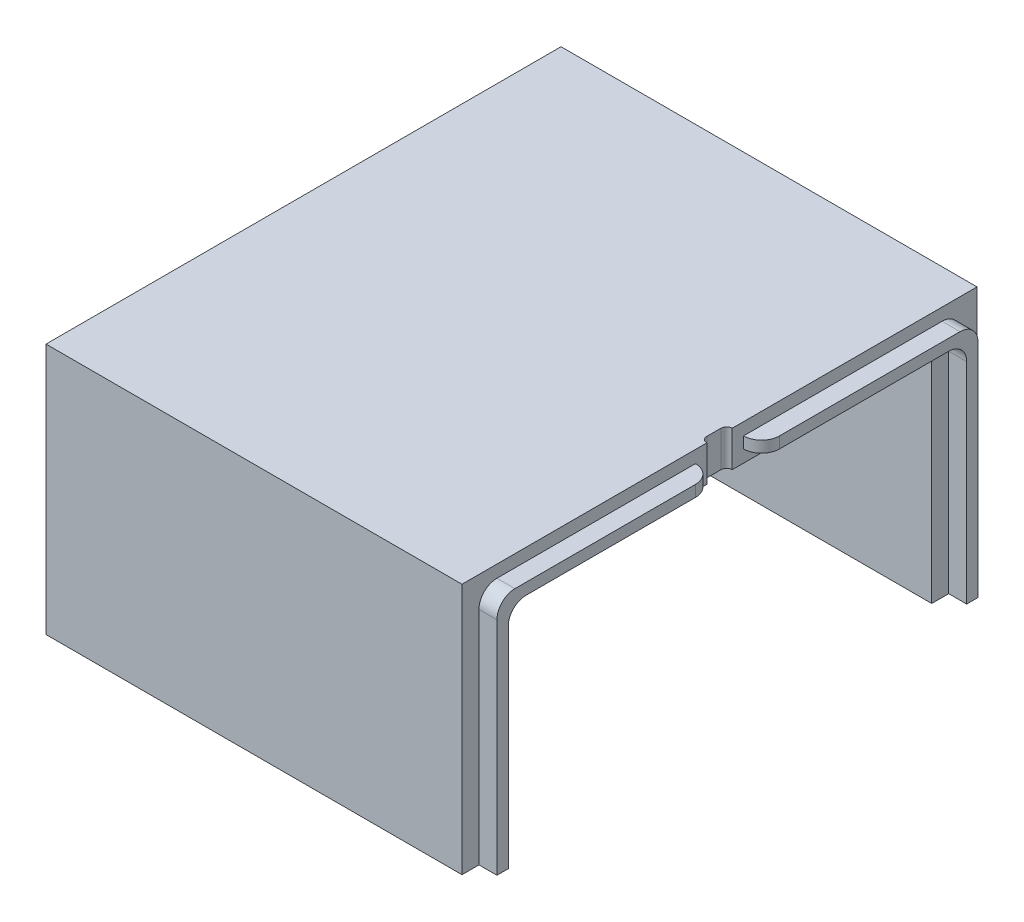
ISO-10303-21;
HEADER;
FILE_DESCRIPTION(('STEP AP214'),'2;1');
FILE_NAME('part.step','',(''),(''),'','','');
FILE_SCHEMA(('AUTOMOTIVE_DESIGN { 1 0 10303 214 1 1 1 1 }'));
ENDSEC;
DATA;
#1=APPLICATION_CONTEXT('core data for automotive mechanical design processes');
#2=APPLICATION_PROTOCOL_DEFINITION('international standard','automotive_design',2000,#1);
#3=PRODUCT_CONTEXT('',#1,'mechanical');
#4=PRODUCT('Part','Part','',(#3));
#5=PRODUCT_RELATED_PRODUCT_CATEGORY('part','',(#4));
#6=PRODUCT_DEFINITION_FORMATION('','',#4);
#7=PRODUCT_DEFINITION_CONTEXT('part definition',#1,'design');
#8=PRODUCT_DEFINITION('design','',#6,#7);
#9=PRODUCT_DEFINITION_SHAPE('','',#8);
#10=(LENGTH_UNIT() NAMED_UNIT(*) SI_UNIT(.MILLI.,.METRE.));
#11=(NAMED_UNIT(*) PLANE_ANGLE_UNIT() SI_UNIT($,.RADIAN.));
#12=(NAMED_UNIT(*) SI_UNIT($,.STERADIAN.) SOLID_ANGLE_UNIT());
#13=UNCERTAINTY_MEASURE_WITH_UNIT(LENGTH_MEASURE(1.E-05),#10,'distance_accuracy_value','');
#14=(GEOMETRIC_REPRESENTATION_CONTEXT(3) GLOBAL_UNCERTAINTY_ASSIGNED_CONTEXT((#13)) GLOBAL_UNIT_ASSIGNED_CONTEXT((#10,
#11,#12)) REPRESENTATION_CONTEXT('',''));
#15=CARTESIAN_POINT('',(0.,0.,0.));
#16=DIRECTION('',(0.,0.,1.));
#17=DIRECTION('',(1.,0.,0.));
#18=AXIS2_PLACEMENT_3D('',#15,#16,#17);
#19=CARTESIAN_POINT('',(0.,19.05,0.));
#20=DIRECTION('',(1.,0.,0.));
#21=DIRECTION('',(0.,0.,-1.));
#22=AXIS2_PLACEMENT_3D('',#19,#20,#21);
#23=PLANE('',#22);
#24=DIRECTION('',(0.,-1.,0.));
#25=VECTOR('',#24,1.);
#26=CARTESIAN_POINT('',(0.,0.,2.5));
#27=LINE('',#26,#25);
#28=CARTESIAN_POINT('',(0.,18.55,2.50000000000001));
#29=VERTEX_POINT('',#28);
#30=CARTESIAN_POINT('',(0.,0.,2.5));
#31=VERTEX_POINT('',#30);
#32=EDGE_CURVE('E249',#29,#31,#27,.T.);
#33=ORIENTED_EDGE('',*,*,#32,.F.);
#34=CARTESIAN_POINT('',(0.,18.55,4.08750000000001));
#35=DIRECTION('',(1.,0.,0.));
#36=DIRECTION('',(0.,0.,-1.));
#37=AXIS2_PLACEMENT_3D('',#34,#35,#36);
#38=CIRCLE('',#37,1.5875);
#39=CARTESIAN_POINT('',(0.,20.1375,4.08750000000001));
#40=VERTEX_POINT('',#39);
#41=EDGE_CURVE('E439',#29,#40,#38,.T.);
#42=ORIENTED_EDGE('',*,*,#41,.T.);
#43=DIRECTION('',(0.,0.,-1.));
#44=VECTOR('',#43,1.);
#45=CARTESIAN_POINT('',(0.,20.1375,0.));
#46=LINE('',#45,#44);
#47=CARTESIAN_POINT('',(0.,20.1375,20.625));
#48=VERTEX_POINT('',#47);
#49=EDGE_CURVE('E270',#48,#40,#46,.T.);
#50=ORIENTED_EDGE('',*,*,#49,.F.);
#51=DIRECTION('',(0.,-1.,0.));
#52=VECTOR('',#51,1.);
#53=CARTESIAN_POINT('',(0.,0.,20.625));
#54=LINE('',#53,#52);
#55=CARTESIAN_POINT('',(0.,21.1375,20.625));
#56=VERTEX_POINT('',#55);
#57=EDGE_CURVE('E267',#56,#48,#54,.T.);
#58=ORIENTED_EDGE('',*,*,#57,.F.);
#59=DIRECTION('',(0.,0.,-1.));
#60=VECTOR('',#59,1.);
#61=CARTESIAN_POINT('',(0.,21.1375,0.));
#62=LINE('',#61,#60);
#63=CARTESIAN_POINT('',(0.,21.1375,3.08750000000001));
#64=VERTEX_POINT('',#63);
#65=EDGE_CURVE('E264',#56,#64,#62,.T.);
#66=ORIENTED_EDGE('',*,*,#65,.T.);
#67=CARTESIAN_POINT('',(0.,19.55,3.08750000000001));
#68=DIRECTION('',(1.,0.,0.));
#69=DIRECTION('',(0.,0.,-1.));
#70=AXIS2_PLACEMENT_3D('',#67,#68,#69);
#71=CIRCLE('',#70,1.5875);
#72=CARTESIAN_POINT('',(0.,19.55,1.50000000000001));
#73=VERTEX_POINT('',#72);
#74=EDGE_CURVE('E11',#64,#73,#71,.F.);
#75=ORIENTED_EDGE('',*,*,#74,.T.);
#76=DIRECTION('',(0.,-1.,0.));
#77=VECTOR('',#76,1.);
#78=CARTESIAN_POINT('',(0.,0.,1.5));
#79=LINE('',#78,#77);
#80=CARTESIAN_POINT('',(0.,0.,1.5));
#81=VERTEX_POINT('',#80);
#82=EDGE_CURVE('E274',#73,#81,#79,.T.);
#83=ORIENTED_EDGE('',*,*,#82,.T.);
#84=DIRECTION('',(0.,0.,1.));
#85=VECTOR('',#84,1.);
#86=CARTESIAN_POINT('',(0.,0.,0.));
#87=LINE('',#86,#85);
#88=CARTESIAN_POINT('',(0.,0.,0.));
#89=VERTEX_POINT('',#88);
#90=EDGE_CURVE('E388',#89,#81,#87,.T.);
#91=ORIENTED_EDGE('',*,*,#90,.F.);
#92=DIRECTION('',(0.,-1.,0.));
#93=VECTOR('',#92,1.);
#94=CARTESIAN_POINT('',(0.,19.05,0.));
#95=LINE('',#94,#93);
#96=CARTESIAN_POINT('',(0.,22.225,0.));
#97=VERTEX_POINT('',#96);
#98=EDGE_CURVE('E408',#97,#89,#95,.T.);
#99=ORIENTED_EDGE('',*,*,#98,.F.);
#100=DIRECTION('',(0.,0.,-1.));
#101=VECTOR('',#100,1.);
#102=CARTESIAN_POINT('',(0.,22.225,0.));
#103=LINE('',#102,#101);
#104=CARTESIAN_POINT('',(0.,22.225,21.625));
#105=VERTEX_POINT('',#104);
#106=EDGE_CURVE('E324',#105,#97,#103,.T.);
#107=ORIENTED_EDGE('',*,*,#106,.F.);
#108=DIRECTION('',(0.,-1.,0.));
#109=VECTOR('',#108,1.);
#110=CARTESIAN_POINT('',(0.,22.225,21.625));
#111=LINE('',#110,#109);
#112=CARTESIAN_POINT('',(0.,19.05,21.625));
#113=VERTEX_POINT('',#112);
#114=EDGE_CURVE('E347',#105,#113,#111,.T.);
#115=ORIENTED_EDGE('',*,*,#114,.T.);
#116=DIRECTION('',(0.,0.,-1.));
#117=VECTOR('',#116,1.);
#118=CARTESIAN_POINT('',(0.,19.05,0.));
#119=LINE('',#118,#117);
#120=CARTESIAN_POINT('',(0.,19.05,4.));
#121=VERTEX_POINT('',#120);
#122=EDGE_CURVE('E323',#113,#121,#119,.T.);
#123=ORIENTED_EDGE('',*,*,#122,.T.);
#124=DIRECTION('',(0.,-1.,0.));
#125=VECTOR('',#124,1.);
#126=CARTESIAN_POINT('',(0.,19.05,4.));
#127=LINE('',#126,#125);
#128=CARTESIAN_POINT('',(0.,0.,4.));
#129=VERTEX_POINT('',#128);
#130=EDGE_CURVE('E410',#121,#129,#127,.T.);
#131=ORIENTED_EDGE('',*,*,#130,.T.);
#132=EDGE_CURVE('E387',#31,#129,#87,.T.);
#133=ORIENTED_EDGE('',*,*,#132,.F.);
#134=EDGE_LOOP('',(#33,#42,#50,#58,#66,#75,#83,#91,#99,#107,#115,#123,#131,#133));
#135=FACE_BOUND('',#134,.T.);
#136=ADVANCED_FACE('F41',(#135),#23,.T.);
#137=CARTESIAN_POINT('',(0.,19.05,41.5));
#138=DIRECTION('',(0.,0.,-1.));
#139=DIRECTION('',(-1.,0.,0.));
#140=AXIS2_PLACEMENT_3D('',#137,#138,#139);
#141=PLANE('',#140);
#142=DIRECTION('',(1.,0.,0.));
#143=VECTOR('',#142,1.);
#144=CARTESIAN_POINT('',(0.,0.,41.5));
#145=LINE('',#144,#143);
#146=CARTESIAN_POINT('',(-32.75,0.,41.5));
#147=VERTEX_POINT('',#146);
#148=CARTESIAN_POINT('',(0.,0.,41.5));
#149=VERTEX_POINT('',#148);
#150=EDGE_CURVE('E368',#147,#149,#145,.T.);
#151=ORIENTED_EDGE('',*,*,#150,.F.);
#152=DIRECTION('',(0.,-1.,0.));
#153=VECTOR('',#152,1.);
#154=CARTESIAN_POINT('',(-32.75,19.05,41.5));
#155=LINE('',#154,#153);
#156=CARTESIAN_POINT('',(-32.75,19.05,41.5));
#157=VERTEX_POINT('',#156);
#158=EDGE_CURVE('E415',#157,#147,#155,.T.);
#159=ORIENTED_EDGE('',*,*,#158,.F.);
#160=DIRECTION('',(1.,0.,0.));
#161=VECTOR('',#160,1.);
#162=CARTESIAN_POINT('',(0.,19.05,41.5));
#163=LINE('',#162,#161);
#164=CARTESIAN_POINT('',(0.,19.05,41.5));
#165=VERTEX_POINT('',#164);
#166=EDGE_CURVE('E369',#157,#165,#163,.T.);
#167=ORIENTED_EDGE('',*,*,#166,.T.);
#168=DIRECTION('',(0.,-1.,0.));
#169=VECTOR('',#168,1.);
#170=CARTESIAN_POINT('',(0.,19.05,41.5));
#171=LINE('',#170,#169);
#172=EDGE_CURVE('E379',#165,#149,#171,.T.);
#173=ORIENTED_EDGE('',*,*,#172,.T.);
#174=EDGE_LOOP('',(#151,#159,#167,#173));
#175=FACE_BOUND('',#174,.T.);
#176=ADVANCED_FACE('F502',(#175),#141,.T.);
#177=CARTESIAN_POINT('',(-32.75,19.05,0.));
#178=DIRECTION('',(1.,0.,0.));
#179=DIRECTION('',(0.,0.,-1.));
#180=AXIS2_PLACEMENT_3D('',#177,#178,#179);
#181=PLANE('',#180);
#182=DIRECTION('',(0.,0.,1.));
#183=VECTOR('',#182,1.);
#184=CARTESIAN_POINT('',(-32.75,0.,0.));
#185=LINE('',#184,#183);
#186=CARTESIAN_POINT('',(-32.75,0.,4.));
#187=VERTEX_POINT('',#186);
#188=EDGE_CURVE('E381',#187,#147,#185,.T.);
#189=ORIENTED_EDGE('',*,*,#188,.F.);
#190=DIRECTION('',(0.,-1.,0.));
#191=VECTOR('',#190,1.);
#192=CARTESIAN_POINT('',(-32.75,19.05,4.));
#193=LINE('',#192,#191);
#194=CARTESIAN_POINT('',(-32.75,19.05,4.));
#195=VERTEX_POINT('',#194);
#196=EDGE_CURVE('E413',#195,#187,#193,.T.);
#197=ORIENTED_EDGE('',*,*,#196,.F.);
#198=DIRECTION('',(0.,0.,1.));
#199=VECTOR('',#198,1.);
#200=CARTESIAN_POINT('',(-32.75,19.05,0.));
#201=LINE('',#200,#199);
#202=EDGE_CURVE('E372',#195,#157,#201,.T.);
#203=ORIENTED_EDGE('',*,*,#202,.T.);
#204=ORIENTED_EDGE('',*,*,#158,.T.);
#205=EDGE_LOOP('',(#189,#197,#203,#204));
#206=FACE_BOUND('',#205,.T.);
#207=ADVANCED_FACE('F508',(#206),#181,.T.);
#208=CARTESIAN_POINT('',(0.,19.05,4.));
#209=DIRECTION('',(0.,0.,1.));
#210=DIRECTION('',(1.,0.,0.));
#211=AXIS2_PLACEMENT_3D('',#208,#209,#210);
#212=PLANE('',#211);
#213=DIRECTION('',(-1.,0.,0.));
#214=VECTOR('',#213,1.);
#215=CARTESIAN_POINT('',(0.,0.,4.));
#216=LINE('',#215,#214);
#217=EDGE_CURVE('E384',#129,#187,#216,.T.);
#218=ORIENTED_EDGE('',*,*,#217,.F.);
#219=ORIENTED_EDGE('',*,*,#130,.F.);
#220=DIRECTION('',(-1.,0.,0.));
#221=VECTOR('',#220,1.);
#222=CARTESIAN_POINT('',(0.,19.05,4.));
#223=LINE('',#222,#221);
#224=EDGE_CURVE('E376',#121,#195,#223,.T.);
#225=ORIENTED_EDGE('',*,*,#224,.T.);
#226=ORIENTED_EDGE('',*,*,#196,.T.);
#227=EDGE_LOOP('',(#218,#219,#225,#226));
#228=FACE_BOUND('',#227,.T.);
#229=ADVANCED_FACE('F533',(#228),#212,.T.);
#230=CARTESIAN_POINT('',(0.,19.05,0.));
#231=DIRECTION('',(0.,0.,1.));
#232=DIRECTION('',(1.,0.,0.));
#233=AXIS2_PLACEMENT_3D('',#230,#231,#232);
#234=PLANE('',#233);
#235=DIRECTION('',(-1.,0.,0.));
#236=VECTOR('',#235,1.);
#237=CARTESIAN_POINT('',(0.,0.,0.));
#238=LINE('',#237,#236);
#239=CARTESIAN_POINT('',(-36.75,0.,0.));
#240=VERTEX_POINT('',#239);
#241=EDGE_CURVE('E390',#89,#240,#238,.T.);
#242=ORIENTED_EDGE('',*,*,#241,.T.);
#243=DIRECTION('',(0.,-1.,0.));
#244=VECTOR('',#243,1.);
#245=CARTESIAN_POINT('',(-36.75,19.05,0.));
#246=LINE('',#245,#244);
#247=CARTESIAN_POINT('',(-36.75,22.225,0.));
#248=VERTEX_POINT('',#247);
#249=EDGE_CURVE('E405',#248,#240,#246,.T.);
#250=ORIENTED_EDGE('',*,*,#249,.F.);
#251=DIRECTION('',(1.,0.,0.));
#252=VECTOR('',#251,1.);
#253=CARTESIAN_POINT('',(0.,22.225,0.));
#254=LINE('',#253,#252);
#255=EDGE_CURVE('E327',#248,#97,#254,.T.);
#256=ORIENTED_EDGE('',*,*,#255,.T.);
#257=ORIENTED_EDGE('',*,*,#98,.T.);
#258=EDGE_LOOP('',(#242,#250,#256,#257));
#259=FACE_BOUND('',#258,.T.);
#260=ADVANCED_FACE('F526',(#259),#234,.F.);
#261=CARTESIAN_POINT('',(-36.75,19.05,0.));
#262=DIRECTION('',(1.,0.,0.));
#263=DIRECTION('',(0.,0.,-1.));
#264=AXIS2_PLACEMENT_3D('',#261,#262,#263);
#265=PLANE('',#264);
#266=DIRECTION('',(0.,0.,1.));
#267=VECTOR('',#266,1.);
#268=CARTESIAN_POINT('',(-36.75,0.,0.));
#269=LINE('',#268,#267);
#270=CARTESIAN_POINT('',(-36.75,0.,45.5));
#271=VERTEX_POINT('',#270);
#272=EDGE_CURVE('E392',#240,#271,#269,.T.);
#273=ORIENTED_EDGE('',*,*,#272,.T.);
#274=DIRECTION('',(0.,-1.,0.));
#275=VECTOR('',#274,1.);
#276=CARTESIAN_POINT('',(-36.75,19.05,45.5));
#277=LINE('',#276,#275);
#278=CARTESIAN_POINT('',(-36.75,22.225,45.5));
#279=VERTEX_POINT('',#278);
#280=EDGE_CURVE('E403',#279,#271,#277,.T.);
#281=ORIENTED_EDGE('',*,*,#280,.F.);
#282=DIRECTION('',(0.,0.,-1.));
#283=VECTOR('',#282,1.);
#284=CARTESIAN_POINT('',(-36.75,22.225,0.));
#285=LINE('',#284,#283);
#286=EDGE_CURVE('E331',#279,#248,#285,.T.);
#287=ORIENTED_EDGE('',*,*,#286,.T.);
#288=ORIENTED_EDGE('',*,*,#249,.T.);
#289=EDGE_LOOP('',(#273,#281,#287,#288));
#290=FACE_BOUND('',#289,.T.);
#291=ADVANCED_FACE('F521',(#290),#265,.F.);
#292=CARTESIAN_POINT('',(0.,19.05,45.5));
#293=DIRECTION('',(0.,0.,1.));
#294=DIRECTION('',(1.,0.,0.));
#295=AXIS2_PLACEMENT_3D('',#292,#293,#294);
#296=PLANE('',#295);
#297=DIRECTION('',(-1.,0.,0.));
#298=VECTOR('',#297,1.);
#299=CARTESIAN_POINT('',(0.,0.,45.5));
#300=LINE('',#299,#298);
#301=CARTESIAN_POINT('',(0.,0.,45.5));
#302=VERTEX_POINT('',#301);
#303=EDGE_CURVE('E395',#302,#271,#300,.T.);
#304=ORIENTED_EDGE('',*,*,#303,.F.);
#305=DIRECTION('',(0.,-1.,0.));
#306=VECTOR('',#305,1.);
#307=CARTESIAN_POINT('',(0.,19.05,45.5));
#308=LINE('',#307,#306);
#309=CARTESIAN_POINT('',(0.,22.225,45.5));
#310=VERTEX_POINT('',#309);
#311=EDGE_CURVE('E400',#310,#302,#308,.T.);
#312=ORIENTED_EDGE('',*,*,#311,.F.);
#313=DIRECTION('',(1.,0.,0.));
#314=VECTOR('',#313,1.);
#315=CARTESIAN_POINT('',(0.,22.225,45.5));
#316=LINE('',#315,#314);
#317=EDGE_CURVE('E334',#279,#310,#316,.T.);
#318=ORIENTED_EDGE('',*,*,#317,.F.);
#319=ORIENTED_EDGE('',*,*,#280,.T.);
#320=EDGE_LOOP('',(#304,#312,#318,#319));
#321=FACE_BOUND('',#320,.T.);
#322=ADVANCED_FACE('F514',(#321),#296,.T.);
#323=DIRECTION('',(0.,0.,-1.));
#324=VECTOR('',#323,1.);
#325=CARTESIAN_POINT('',(0.,20.1375,0.));
#326=LINE('',#325,#324);
#327=CARTESIAN_POINT('',(0.,20.1375,41.4125));
#328=VERTEX_POINT('',#327);
#329=CARTESIAN_POINT('',(0.,20.1375,24.875));
#330=VERTEX_POINT('',#329);
#331=EDGE_CURVE('E282',#328,#330,#326,.T.);
#332=ORIENTED_EDGE('',*,*,#331,.F.);
#333=CARTESIAN_POINT('',(0.,18.55,41.4125));
#334=DIRECTION('',(1.,0.,0.));
#335=DIRECTION('',(0.,0.,-1.));
#336=AXIS2_PLACEMENT_3D('',#333,#334,#335);
#337=CIRCLE('',#336,1.5875);
#338=CARTESIAN_POINT('',(0.,18.55,43.));
#339=VERTEX_POINT('',#338);
#340=EDGE_CURVE('E422',#328,#339,#337,.T.);
#341=ORIENTED_EDGE('',*,*,#340,.T.);
#342=DIRECTION('',(0.,1.,0.));
#343=VECTOR('',#342,1.);
#344=CARTESIAN_POINT('',(0.,0.,43.));
#345=LINE('',#344,#343);
#346=CARTESIAN_POINT('',(0.,0.,43.));
#347=VERTEX_POINT('',#346);
#348=EDGE_CURVE('E302',#347,#339,#345,.T.);
#349=ORIENTED_EDGE('',*,*,#348,.F.);
#350=EDGE_CURVE('E373',#149,#347,#87,.T.);
#351=ORIENTED_EDGE('',*,*,#350,.F.);
#352=ORIENTED_EDGE('',*,*,#172,.F.);
#353=DIRECTION('',(0.,0.,-1.));
#354=VECTOR('',#353,1.);
#355=CARTESIAN_POINT('',(0.,19.05,0.));
#356=LINE('',#355,#354);
#357=CARTESIAN_POINT('',(0.,19.05,23.875));
#358=VERTEX_POINT('',#357);
#359=EDGE_CURVE('E350',#165,#358,#356,.T.);
#360=ORIENTED_EDGE('',*,*,#359,.T.);
#361=DIRECTION('',(0.,-1.,0.));
#362=VECTOR('',#361,1.);
#363=CARTESIAN_POINT('',(0.,22.225,23.875));
#364=LINE('',#363,#362);
#365=CARTESIAN_POINT('',(0.,22.225,23.875));
#366=VERTEX_POINT('',#365);
#367=EDGE_CURVE('E365',#366,#358,#364,.T.);
#368=ORIENTED_EDGE('',*,*,#367,.F.);
#369=DIRECTION('',(0.,0.,-1.));
#370=VECTOR('',#369,1.);
#371=CARTESIAN_POINT('',(0.,22.225,0.));
#372=LINE('',#371,#370);
#373=EDGE_CURVE('E337',#310,#366,#372,.T.);
#374=ORIENTED_EDGE('',*,*,#373,.F.);
#375=ORIENTED_EDGE('',*,*,#311,.T.);
#376=CARTESIAN_POINT('',(0.,0.,44.));
#377=VERTEX_POINT('',#376);
#378=EDGE_CURVE('E398',#377,#302,#87,.T.);
#379=ORIENTED_EDGE('',*,*,#378,.F.);
#380=DIRECTION('',(0.,1.,0.));
#381=VECTOR('',#380,1.);
#382=CARTESIAN_POINT('',(0.,0.,44.));
#383=LINE('',#382,#381);
#384=CARTESIAN_POINT('',(0.,19.55,44.));
#385=VERTEX_POINT('',#384);
#386=EDGE_CURVE('E299',#377,#385,#383,.T.);
#387=ORIENTED_EDGE('',*,*,#386,.T.);
#388=CARTESIAN_POINT('',(0.,19.55,42.4125));
#389=DIRECTION('',(1.,0.,0.));
#390=DIRECTION('',(0.,0.,-1.));
#391=AXIS2_PLACEMENT_3D('',#388,#389,#390);
#392=CIRCLE('',#391,1.5875);
#393=CARTESIAN_POINT('',(0.,21.1375,42.4125));
#394=VERTEX_POINT('',#393);
#395=EDGE_CURVE('E457',#385,#394,#392,.F.);
#396=ORIENTED_EDGE('',*,*,#395,.T.);
#397=DIRECTION('',(0.,0.,-1.));
#398=VECTOR('',#397,1.);
#399=CARTESIAN_POINT('',(0.,21.1375,0.));
#400=LINE('',#399,#398);
#401=CARTESIAN_POINT('',(0.,21.1375,24.875));
#402=VERTEX_POINT('',#401);
#403=EDGE_CURVE('E296',#394,#402,#400,.T.);
#404=ORIENTED_EDGE('',*,*,#403,.T.);
#405=DIRECTION('',(0.,-1.,0.));
#406=VECTOR('',#405,1.);
#407=CARTESIAN_POINT('',(0.,0.,24.875));
#408=LINE('',#407,#406);
#409=EDGE_CURVE('E252',#402,#330,#408,.T.);
#410=ORIENTED_EDGE('',*,*,#409,.T.);
#411=EDGE_LOOP('',(#332,#341,#349,#351,#352,#360,#368,#374,#375,#379,#387,#396,#404,#410));
#412=FACE_BOUND('',#411,.T.);
#413=ADVANCED_FACE('F461',(#412),#23,.T.);
#414=CARTESIAN_POINT('',(0.,0.,0.));
#415=DIRECTION('',(0.,1.,0.));
#416=DIRECTION('',(0.,0.,1.));
#417=AXIS2_PLACEMENT_3D('',#414,#415,#416);
#418=PLANE('',#417);
#419=CARTESIAN_POINT('',(-18.375,0.,43.));
#420=DIRECTION('',(0.,-1.,0.));
#421=DIRECTION('',(0.,0.,-1.));
#422=AXIS2_PLACEMENT_3D('',#419,#420,#421);
#423=CIRCLE('',#422,0.88899999999999);
#424=CARTESIAN_POINT('',(-18.375,0.,42.111));
#425=VERTEX_POINT('',#424);
#426=EDGE_CURVE('E311',#425,#425,#423,.T.);
#427=ORIENTED_EDGE('',*,*,#426,.F.);
#428=EDGE_LOOP('',(#427));
#429=FACE_BOUND('',#428,.T.);
#430=CARTESIAN_POINT('',(-18.375,0.,2.5));
#431=DIRECTION('',(0.,-1.,0.));
#432=DIRECTION('',(0.,0.,-1.));
#433=AXIS2_PLACEMENT_3D('',#430,#431,#432);
#434=CIRCLE('',#433,0.88899999999999);
#435=CARTESIAN_POINT('',(-18.375,0.,1.61100000000001));
#436=VERTEX_POINT('',#435);
#437=EDGE_CURVE('E317',#436,#436,#434,.T.);
#438=ORIENTED_EDGE('',*,*,#437,.F.);
#439=EDGE_LOOP('',(#438));
#440=FACE_BOUND('',#439,.T.);
#441=ORIENTED_EDGE('',*,*,#150,.T.);
#442=ORIENTED_EDGE('',*,*,#350,.T.);
#443=DIRECTION('',(-1.,0.,0.));
#444=VECTOR('',#443,1.);
#445=CARTESIAN_POINT('',(1.5875,0.,43.));
#446=LINE('',#445,#444);
#447=CARTESIAN_POINT('',(1.5875,0.,43.));
#448=VERTEX_POINT('',#447);
#449=EDGE_CURVE('E293',#448,#347,#446,.T.);
#450=ORIENTED_EDGE('',*,*,#449,.F.);
#451=DIRECTION('',(0.,0.,-1.));
#452=VECTOR('',#451,1.);
#453=CARTESIAN_POINT('',(1.5875,0.,0.));
#454=LINE('',#453,#452);
#455=CARTESIAN_POINT('',(1.5875,0.,44.));
#456=VERTEX_POINT('',#455);
#457=EDGE_CURVE('E285',#456,#448,#454,.T.);
#458=ORIENTED_EDGE('',*,*,#457,.F.);
#459=DIRECTION('',(-1.,0.,0.));
#460=VECTOR('',#459,1.);
#461=CARTESIAN_POINT('',(1.5875,0.,44.));
#462=LINE('',#461,#460);
#463=EDGE_CURVE('E308',#456,#377,#462,.T.);
#464=ORIENTED_EDGE('',*,*,#463,.T.);
#465=ORIENTED_EDGE('',*,*,#378,.T.);
#466=ORIENTED_EDGE('',*,*,#303,.T.);
#467=ORIENTED_EDGE('',*,*,#272,.F.);
#468=ORIENTED_EDGE('',*,*,#241,.F.);
#469=ORIENTED_EDGE('',*,*,#90,.T.);
#470=DIRECTION('',(-1.,0.,0.));
#471=VECTOR('',#470,1.);
#472=CARTESIAN_POINT('',(1.5875,0.,1.5));
#473=LINE('',#472,#471);
#474=CARTESIAN_POINT('',(1.5875,0.,1.5));
#475=VERTEX_POINT('',#474);
#476=EDGE_CURVE('E253',#475,#81,#473,.T.);
#477=ORIENTED_EDGE('',*,*,#476,.F.);
#478=DIRECTION('',(0.,0.,-1.));
#479=VECTOR('',#478,1.);
#480=CARTESIAN_POINT('',(1.5875,0.,0.));
#481=LINE('',#480,#479);
#482=CARTESIAN_POINT('',(1.5875,0.,2.5));
#483=VERTEX_POINT('',#482);
#484=EDGE_CURVE('E236',#483,#475,#481,.T.);
#485=ORIENTED_EDGE('',*,*,#484,.F.);
#486=DIRECTION('',(-1.,0.,0.));
#487=VECTOR('',#486,1.);
#488=CARTESIAN_POINT('',(1.5875,0.,2.5));
#489=LINE('',#488,#487);
#490=EDGE_CURVE('E246',#483,#31,#489,.T.);
#491=ORIENTED_EDGE('',*,*,#490,.T.);
#492=ORIENTED_EDGE('',*,*,#132,.T.);
#493=ORIENTED_EDGE('',*,*,#217,.T.);
#494=ORIENTED_EDGE('',*,*,#188,.T.);
#495=EDGE_LOOP('',(#441,#442,#450,#458,#464,#465,#466,#467,#468,#469,#477,#485,#491,#492,#493,#494));
#496=FACE_BOUND('',#495,.T.);
#497=ADVANCED_FACE('F256',(#429,#440,#496),#418,.F.);
#498=CARTESIAN_POINT('',(0.,22.225,23.375));
#499=DIRECTION('',(0.,-1.,0.));
#500=DIRECTION('',(0.,0.,-1.));
#501=AXIS2_PLACEMENT_3D('',#498,#499,#500);
#502=CYLINDRICAL_SURFACE('',#501,0.499999999999994);
#503=CARTESIAN_POINT('',(0.,19.05,23.375));
#504=DIRECTION('',(0.,1.,0.));
#505=DIRECTION('',(0.,0.,1.));
#506=AXIS2_PLACEMENT_3D('',#503,#504,#505);
#507=CIRCLE('',#506,0.499999999999994);
#508=CARTESIAN_POINT('',(-0.499999999999991,19.05,23.375));
#509=VERTEX_POINT('',#508);
#510=EDGE_CURVE('E352',#509,#358,#507,.T.);
#511=ORIENTED_EDGE('',*,*,#510,.F.);
#512=DIRECTION('',(0.,-1.,0.));
#513=VECTOR('',#512,1.);
#514=CARTESIAN_POINT('',(-0.499999999999991,22.225,23.375));
#515=LINE('',#514,#513);
#516=CARTESIAN_POINT('',(-0.499999999999991,22.225,23.375));
#517=VERTEX_POINT('',#516);
#518=EDGE_CURVE('E363',#517,#509,#515,.T.);
#519=ORIENTED_EDGE('',*,*,#518,.F.);
#520=CARTESIAN_POINT('',(0.,22.225,23.375));
#521=DIRECTION('',(0.,1.,0.));
#522=DIRECTION('',(0.,0.,1.));
#523=AXIS2_PLACEMENT_3D('',#520,#521,#522);
#524=CIRCLE('',#523,0.499999999999994);
#525=EDGE_CURVE('E339',#517,#366,#524,.T.);
#526=ORIENTED_EDGE('',*,*,#525,.T.);
#527=ORIENTED_EDGE('',*,*,#367,.T.);
#528=EDGE_LOOP('',(#511,#519,#526,#527));
#529=FACE_BOUND('',#528,.T.);
#530=ADVANCED_FACE('F519',(#529),#502,.F.);
#531=CARTESIAN_POINT('',(-0.499999999999993,22.225,0.));
#532=DIRECTION('',(-1.,0.,0.));
#533=DIRECTION('',(0.,0.,1.));
#534=AXIS2_PLACEMENT_3D('',#531,#532,#533);
#535=PLANE('',#534);
#536=DIRECTION('',(0.,0.,-1.));
#537=VECTOR('',#536,1.);
#538=CARTESIAN_POINT('',(-0.499999999999993,19.05,0.));
#539=LINE('',#538,#537);
#540=CARTESIAN_POINT('',(-0.499999999999997,19.05,22.125));
#541=VERTEX_POINT('',#540);
#542=EDGE_CURVE('E355',#509,#541,#539,.T.);
#543=ORIENTED_EDGE('',*,*,#542,.T.);
#544=DIRECTION('',(0.,-1.,0.));
#545=VECTOR('',#544,1.);
#546=CARTESIAN_POINT('',(-0.499999999999997,22.225,22.125));
#547=LINE('',#546,#545);
#548=CARTESIAN_POINT('',(-0.499999999999997,22.225,22.125));
#549=VERTEX_POINT('',#548);
#550=EDGE_CURVE('E361',#549,#541,#547,.T.);
#551=ORIENTED_EDGE('',*,*,#550,.F.);
#552=DIRECTION('',(0.,0.,-1.));
#553=VECTOR('',#552,1.);
#554=CARTESIAN_POINT('',(-0.499999999999993,22.225,0.));
#555=LINE('',#554,#553);
#556=EDGE_CURVE('E342',#517,#549,#555,.T.);
#557=ORIENTED_EDGE('',*,*,#556,.F.);
#558=ORIENTED_EDGE('',*,*,#518,.T.);
#559=EDGE_LOOP('',(#543,#551,#557,#558));
#560=FACE_BOUND('',#559,.T.);
#561=ADVANCED_FACE('F609',(#560),#535,.F.);
#562=CARTESIAN_POINT('',(0.,22.225,22.125));
#563=DIRECTION('',(0.,-1.,0.));
#564=DIRECTION('',(0.,0.,-1.));
#565=AXIS2_PLACEMENT_3D('',#562,#563,#564);
#566=CYLINDRICAL_SURFACE('',#565,0.499999999999994);
#567=CARTESIAN_POINT('',(0.,19.05,22.125));
#568=DIRECTION('',(0.,1.,0.));
#569=DIRECTION('',(0.,0.,1.));
#570=AXIS2_PLACEMENT_3D('',#567,#568,#569);
#571=CIRCLE('',#570,0.499999999999994);
#572=EDGE_CURVE('E328',#113,#541,#571,.T.);
#573=ORIENTED_EDGE('',*,*,#572,.F.);
#574=ORIENTED_EDGE('',*,*,#114,.F.);
#575=CARTESIAN_POINT('',(0.,22.225,22.125));
#576=DIRECTION('',(0.,1.,0.));
#577=DIRECTION('',(0.,0.,1.));
#578=AXIS2_PLACEMENT_3D('',#575,#576,#577);
#579=CIRCLE('',#578,0.499999999999994);
#580=EDGE_CURVE('E344',#105,#549,#579,.T.);
#581=ORIENTED_EDGE('',*,*,#580,.T.);
#582=ORIENTED_EDGE('',*,*,#550,.T.);
#583=EDGE_LOOP('',(#573,#574,#581,#582));
#584=FACE_BOUND('',#583,.T.);
#585=ADVANCED_FACE('F602',(#584),#566,.F.);
#586=CARTESIAN_POINT('',(0.,22.225,23.375));
#587=DIRECTION('',(0.,1.,0.));
#588=DIRECTION('',(0.,0.,1.));
#589=AXIS2_PLACEMENT_3D('',#586,#587,#588);
#590=PLANE('',#589);
#591=ORIENTED_EDGE('',*,*,#106,.T.);
#592=ORIENTED_EDGE('',*,*,#255,.F.);
#593=ORIENTED_EDGE('',*,*,#286,.F.);
#594=ORIENTED_EDGE('',*,*,#317,.T.);
#595=ORIENTED_EDGE('',*,*,#373,.T.);
#596=ORIENTED_EDGE('',*,*,#525,.F.);
#597=ORIENTED_EDGE('',*,*,#556,.T.);
#598=ORIENTED_EDGE('',*,*,#580,.F.);
#599=EDGE_LOOP('',(#591,#592,#593,#594,#595,#596,#597,#598));
#600=FACE_BOUND('',#599,.T.);
#601=ADVANCED_FACE('F599',(#600),#590,.T.);
#602=CARTESIAN_POINT('',(0.,19.05,23.375));
#603=DIRECTION('',(0.,1.,0.));
#604=DIRECTION('',(0.,0.,1.));
#605=AXIS2_PLACEMENT_3D('',#602,#603,#604);
#606=PLANE('',#605);
#607=ORIENTED_EDGE('',*,*,#166,.F.);
#608=ORIENTED_EDGE('',*,*,#202,.F.);
#609=ORIENTED_EDGE('',*,*,#224,.F.);
#610=ORIENTED_EDGE('',*,*,#122,.F.);
#611=ORIENTED_EDGE('',*,*,#572,.T.);
#612=ORIENTED_EDGE('',*,*,#542,.F.);
#613=ORIENTED_EDGE('',*,*,#510,.T.);
#614=ORIENTED_EDGE('',*,*,#359,.F.);
#615=EDGE_LOOP('',(#607,#608,#609,#610,#611,#612,#613,#614));
#616=FACE_BOUND('',#615,.T.);
#617=ADVANCED_FACE('F597',(#616),#606,.F.);
#618=CARTESIAN_POINT('',(-18.375,5.73,2.5));
#619=DIRECTION('',(0.,-1.,0.));
#620=DIRECTION('',(0.,0.,-1.));
#621=AXIS2_PLACEMENT_3D('',#618,#619,#620);
#622=CONICAL_SURFACE('',#621,0.888999999999997,1.02974425867665);
#623=CARTESIAN_POINT('',(-18.375,6.2641650903155,2.5));
#624=VERTEX_POINT('',#623);
#625=VERTEX_LOOP('',#624);
#626=FACE_BOUND('',#625,.T.);
#627=CARTESIAN_POINT('',(-18.375,5.73,2.5));
#628=DIRECTION('',(0.,-1.,0.));
#629=DIRECTION('',(0.,0.,-1.));
#630=AXIS2_PLACEMENT_3D('',#627,#628,#629);
#631=CIRCLE('',#630,0.888999999999997);
#632=CARTESIAN_POINT('',(-18.375,5.73,1.61100000000001));
#633=VERTEX_POINT('',#632);
#634=EDGE_CURVE('E320',#633,#633,#631,.T.);
#635=ORIENTED_EDGE('',*,*,#634,.T.);
#636=EDGE_LOOP('',(#635));
#637=FACE_BOUND('',#636,.T.);
#638=ADVANCED_FACE('F593',(#626,#637),#622,.F.);
#639=CARTESIAN_POINT('',(-18.375,0.,2.5));
#640=DIRECTION('',(0.,-1.,0.));
#641=DIRECTION('',(0.,0.,-1.));
#642=AXIS2_PLACEMENT_3D('',#639,#640,#641);
#643=CYLINDRICAL_SURFACE('',#642,0.888999999999994);
#644=ORIENTED_EDGE('',*,*,#634,.F.);
#645=EDGE_LOOP('',(#644));
#646=FACE_BOUND('',#645,.T.);
#647=ORIENTED_EDGE('',*,*,#437,.T.);
#648=EDGE_LOOP('',(#647));
#649=FACE_BOUND('',#648,.T.);
#650=ADVANCED_FACE('F589',(#646,#649),#643,.F.);
#651=CARTESIAN_POINT('',(-18.375,5.73,43.));
#652=DIRECTION('',(0.,-1.,0.));
#653=DIRECTION('',(0.,0.,-1.));
#654=AXIS2_PLACEMENT_3D('',#651,#652,#653);
#655=CONICAL_SURFACE('',#654,0.888999999999997,1.02974425867665);
#656=CARTESIAN_POINT('',(-18.375,6.2641650903155,43.));
#657=VERTEX_POINT('',#656);
#658=VERTEX_LOOP('',#657);
#659=FACE_BOUND('',#658,.T.);
#660=CARTESIAN_POINT('',(-18.375,5.73,43.));
#661=DIRECTION('',(0.,-1.,0.));
#662=DIRECTION('',(0.,0.,-1.));
#663=AXIS2_PLACEMENT_3D('',#660,#661,#662);
#664=CIRCLE('',#663,0.888999999999997);
#665=CARTESIAN_POINT('',(-18.375,5.73,42.111));
#666=VERTEX_POINT('',#665);
#667=EDGE_CURVE('E314',#666,#666,#664,.T.);
#668=ORIENTED_EDGE('',*,*,#667,.T.);
#669=EDGE_LOOP('',(#668));
#670=FACE_BOUND('',#669,.T.);
#671=ADVANCED_FACE('F585',(#659,#670),#655,.F.);
#672=CARTESIAN_POINT('',(-18.375,0.,43.));
#673=DIRECTION('',(0.,-1.,0.));
#674=DIRECTION('',(0.,0.,-1.));
#675=AXIS2_PLACEMENT_3D('',#672,#673,#674);
#676=CYLINDRICAL_SURFACE('',#675,0.888999999999994);
#677=ORIENTED_EDGE('',*,*,#667,.F.);
#678=EDGE_LOOP('',(#677));
#679=FACE_BOUND('',#678,.T.);
#680=ORIENTED_EDGE('',*,*,#426,.T.);
#681=EDGE_LOOP('',(#680));
#682=FACE_BOUND('',#681,.T.);
#683=ADVANCED_FACE('F582',(#679,#682),#676,.F.);
#684=CARTESIAN_POINT('',(1.5875,21.1375,0.));
#685=DIRECTION('',(0.,1.,0.));
#686=DIRECTION('',(0.,0.,1.));
#687=AXIS2_PLACEMENT_3D('',#684,#685,#686);
#688=PLANE('',#687);
#689=ORIENTED_EDGE('',*,*,#403,.F.);
#690=DIRECTION('',(-1.,0.,0.));
#691=VECTOR('',#690,1.);
#692=CARTESIAN_POINT('',(1.5875,21.1375,42.4125));
#693=LINE('',#692,#691);
#694=CARTESIAN_POINT('',(1.5875,21.1375,42.4125));
#695=VERTEX_POINT('',#694);
#696=EDGE_CURVE('E431',#394,#695,#693,.F.);
#697=ORIENTED_EDGE('',*,*,#696,.T.);
#698=DIRECTION('',(0.,0.,-1.));
#699=VECTOR('',#698,1.);
#700=CARTESIAN_POINT('',(1.5875,21.1375,0.));
#701=LINE('',#700,#699);
#702=CARTESIAN_POINT('',(1.5875,21.1375,26.4625));
#703=VERTEX_POINT('',#702);
#704=EDGE_CURVE('E278',#695,#703,#701,.T.);
#705=ORIENTED_EDGE('',*,*,#704,.T.);
#706=CARTESIAN_POINT('',(0.,21.1375,26.4625));
#707=DIRECTION('',(0.,1.,0.));
#708=DIRECTION('',(0.,0.,1.));
#709=AXIS2_PLACEMENT_3D('',#706,#707,#708);
#710=CIRCLE('',#709,1.5875);
#711=EDGE_CURVE('E429',#703,#402,#710,.T.);
#712=ORIENTED_EDGE('',*,*,#711,.T.);
#713=EDGE_LOOP('',(#689,#697,#705,#712));
#714=FACE_BOUND('',#713,.T.);
#715=ADVANCED_FACE('F468',(#714),#688,.T.);
#716=CARTESIAN_POINT('',(1.5875,0.,44.));
#717=DIRECTION('',(0.,0.,1.));
#718=DIRECTION('',(1.,0.,0.));
#719=AXIS2_PLACEMENT_3D('',#716,#717,#718);
#720=PLANE('',#719);
#721=DIRECTION('',(0.,1.,0.));
#722=VECTOR('',#721,1.);
#723=CARTESIAN_POINT('',(1.5875,0.,44.));
#724=LINE('',#723,#722);
#725=CARTESIAN_POINT('',(1.5875,19.55,44.));
#726=VERTEX_POINT('',#725);
#727=EDGE_CURVE('E281',#456,#726,#724,.T.);
#728=ORIENTED_EDGE('',*,*,#727,.T.);
#729=DIRECTION('',(-1.,0.,0.));
#730=VECTOR('',#729,1.);
#731=CARTESIAN_POINT('',(1.5875,19.55,44.));
#732=LINE('',#731,#730);
#733=EDGE_CURVE('E426',#726,#385,#732,.T.);
#734=ORIENTED_EDGE('',*,*,#733,.T.);
#735=ORIENTED_EDGE('',*,*,#386,.F.);
#736=ORIENTED_EDGE('',*,*,#463,.F.);
#737=EDGE_LOOP('',(#728,#734,#735,#736));
#738=FACE_BOUND('',#737,.T.);
#739=ADVANCED_FACE('F477',(#738),#720,.T.);
#740=CARTESIAN_POINT('',(1.5875,0.,43.));
#741=DIRECTION('',(0.,0.,1.));
#742=DIRECTION('',(1.,0.,0.));
#743=AXIS2_PLACEMENT_3D('',#740,#741,#742);
#744=PLANE('',#743);
#745=ORIENTED_EDGE('',*,*,#348,.T.);
#746=DIRECTION('',(-1.,0.,0.));
#747=VECTOR('',#746,1.);
#748=CARTESIAN_POINT('',(1.5875,18.55,43.));
#749=LINE('',#748,#747);
#750=CARTESIAN_POINT('',(1.5875,18.55,43.));
#751=VERTEX_POINT('',#750);
#752=EDGE_CURVE('E424',#339,#751,#749,.F.);
#753=ORIENTED_EDGE('',*,*,#752,.T.);
#754=DIRECTION('',(0.,1.,0.));
#755=VECTOR('',#754,1.);
#756=CARTESIAN_POINT('',(1.5875,0.,43.));
#757=LINE('',#756,#755);
#758=EDGE_CURVE('E287',#448,#751,#757,.T.);
#759=ORIENTED_EDGE('',*,*,#758,.F.);
#760=ORIENTED_EDGE('',*,*,#449,.T.);
#761=EDGE_LOOP('',(#745,#753,#759,#760));
#762=FACE_BOUND('',#761,.T.);
#763=ADVANCED_FACE('F569',(#762),#744,.F.);
#764=CARTESIAN_POINT('',(1.5875,20.1375,0.));
#765=DIRECTION('',(0.,1.,0.));
#766=DIRECTION('',(0.,0.,1.));
#767=AXIS2_PLACEMENT_3D('',#764,#765,#766);
#768=PLANE('',#767);
#769=DIRECTION('',(0.,0.,-1.));
#770=VECTOR('',#769,1.);
#771=CARTESIAN_POINT('',(1.5875,20.1375,0.));
#772=LINE('',#771,#770);
#773=CARTESIAN_POINT('',(1.5875,20.1375,41.4125));
#774=VERTEX_POINT('',#773);
#775=CARTESIAN_POINT('',(1.5875,20.1375,26.4625));
#776=VERTEX_POINT('',#775);
#777=EDGE_CURVE('E290',#774,#776,#772,.T.);
#778=ORIENTED_EDGE('',*,*,#777,.F.);
#779=DIRECTION('',(-1.,0.,0.));
#780=VECTOR('',#779,1.);
#781=CARTESIAN_POINT('',(0.,20.1375,41.4125));
#782=LINE('',#781,#780);
#783=EDGE_CURVE('E419',#774,#328,#782,.T.);
#784=ORIENTED_EDGE('',*,*,#783,.T.);
#785=ORIENTED_EDGE('',*,*,#331,.T.);
#786=CARTESIAN_POINT('',(0.,20.1375,26.4625));
#787=DIRECTION('',(0.,1.,0.));
#788=DIRECTION('',(0.,0.,1.));
#789=AXIS2_PLACEMENT_3D('',#786,#787,#788);
#790=CIRCLE('',#789,1.5875);
#791=EDGE_CURVE('E417',#330,#776,#790,.F.);
#792=ORIENTED_EDGE('',*,*,#791,.T.);
#793=EDGE_LOOP('',(#778,#784,#785,#792));
#794=FACE_BOUND('',#793,.T.);
#795=ADVANCED_FACE('F490',(#794),#768,.F.);
#796=CARTESIAN_POINT('',(1.5875,0.,0.));
#797=DIRECTION('',(1.,0.,0.));
#798=DIRECTION('',(0.,0.,-1.));
#799=AXIS2_PLACEMENT_3D('',#796,#797,#798);
#800=PLANE('',#799);
#801=ORIENTED_EDGE('',*,*,#704,.F.);
#802=CARTESIAN_POINT('',(1.5875,19.55,42.4125));
#803=DIRECTION('',(1.,0.,0.));
#804=DIRECTION('',(0.,0.,-1.));
#805=AXIS2_PLACEMENT_3D('',#802,#803,#804);
#806=CIRCLE('',#805,1.5875);
#807=EDGE_CURVE('E435',#695,#726,#806,.T.);
#808=ORIENTED_EDGE('',*,*,#807,.T.);
#809=ORIENTED_EDGE('',*,*,#727,.F.);
#810=ORIENTED_EDGE('',*,*,#457,.T.);
#811=ORIENTED_EDGE('',*,*,#758,.T.);
#812=CARTESIAN_POINT('',(1.5875,18.55,41.4125));
#813=DIRECTION('',(1.,0.,0.));
#814=DIRECTION('',(0.,0.,-1.));
#815=AXIS2_PLACEMENT_3D('',#812,#813,#814);
#816=CIRCLE('',#815,1.5875);
#817=EDGE_CURVE('E455',#751,#774,#816,.F.);
#818=ORIENTED_EDGE('',*,*,#817,.T.);
#819=ORIENTED_EDGE('',*,*,#777,.T.);
#820=DIRECTION('',(0.,-1.,0.));
#821=VECTOR('',#820,1.);
#822=CARTESIAN_POINT('',(1.5875,0.,26.4625));
#823=LINE('',#822,#821);
#824=EDGE_CURVE('E433',#776,#703,#823,.F.);
#825=ORIENTED_EDGE('',*,*,#824,.T.);
#826=EDGE_LOOP('',(#801,#808,#809,#810,#811,#818,#819,#825));
#827=FACE_BOUND('',#826,.T.);
#828=ADVANCED_FACE('F475',(#827),#800,.T.);
#829=CARTESIAN_POINT('',(1.5875,21.1375,0.));
#830=DIRECTION('',(0.,1.,0.));
#831=DIRECTION('',(0.,0.,1.));
#832=AXIS2_PLACEMENT_3D('',#829,#830,#831);
#833=PLANE('',#832);
#834=DIRECTION('',(0.,0.,-1.));
#835=VECTOR('',#834,1.);
#836=CARTESIAN_POINT('',(1.5875,21.1375,0.));
#837=LINE('',#836,#835);
#838=CARTESIAN_POINT('',(1.5875,21.1375,19.0375));
#839=VERTEX_POINT('',#838);
#840=CARTESIAN_POINT('',(1.5875,21.1375,3.08750000000001));
#841=VERTEX_POINT('',#840);
#842=EDGE_CURVE('E276',#839,#841,#837,.T.);
#843=ORIENTED_EDGE('',*,*,#842,.T.);
#844=DIRECTION('',(-1.,0.,0.));
#845=VECTOR('',#844,1.);
#846=CARTESIAN_POINT('',(1.5875,21.1375,3.08750000000001));
#847=LINE('',#846,#845);
#848=EDGE_CURVE('E447',#841,#64,#847,.T.);
#849=ORIENTED_EDGE('',*,*,#848,.T.);
#850=ORIENTED_EDGE('',*,*,#65,.F.);
#851=CARTESIAN_POINT('',(0.,21.1375,19.0375));
#852=DIRECTION('',(0.,1.,0.));
#853=DIRECTION('',(0.,0.,1.));
#854=AXIS2_PLACEMENT_3D('',#851,#852,#853);
#855=CIRCLE('',#854,1.5875);
#856=EDGE_CURVE('E445',#56,#839,#855,.T.);
#857=ORIENTED_EDGE('',*,*,#856,.T.);
#858=EDGE_LOOP('',(#843,#849,#850,#857));
#859=FACE_BOUND('',#858,.T.);
#860=ADVANCED_FACE('F555',(#859),#833,.T.);
#861=CARTESIAN_POINT('',(1.5875,20.1375,0.));
#862=DIRECTION('',(0.,1.,0.));
#863=DIRECTION('',(0.,0.,1.));
#864=AXIS2_PLACEMENT_3D('',#861,#862,#863);
#865=PLANE('',#864);
#866=ORIENTED_EDGE('',*,*,#49,.T.);
#867=DIRECTION('',(-1.,0.,0.));
#868=VECTOR('',#867,1.);
#869=CARTESIAN_POINT('',(1.5875,20.1375,4.08750000000001));
#870=LINE('',#869,#868);
#871=CARTESIAN_POINT('',(1.5875,20.1375,4.08750000000001));
#872=VERTEX_POINT('',#871);
#873=EDGE_CURVE('E443',#40,#872,#870,.F.);
#874=ORIENTED_EDGE('',*,*,#873,.T.);
#875=DIRECTION('',(0.,0.,-1.));
#876=VECTOR('',#875,1.);
#877=CARTESIAN_POINT('',(1.5875,20.1375,0.));
#878=LINE('',#877,#876);
#879=CARTESIAN_POINT('',(1.5875,20.1375,19.0375));
#880=VERTEX_POINT('',#879);
#881=EDGE_CURVE('E243',#880,#872,#878,.T.);
#882=ORIENTED_EDGE('',*,*,#881,.F.);
#883=CARTESIAN_POINT('',(0.,20.1375,19.0375));
#884=DIRECTION('',(0.,1.,0.));
#885=DIRECTION('',(0.,0.,1.));
#886=AXIS2_PLACEMENT_3D('',#883,#884,#885);
#887=CIRCLE('',#886,1.5875);
#888=EDGE_CURVE('E441',#880,#48,#887,.F.);
#889=ORIENTED_EDGE('',*,*,#888,.T.);
#890=EDGE_LOOP('',(#866,#874,#882,#889));
#891=FACE_BOUND('',#890,.T.);
#892=ADVANCED_FACE('F643',(#891),#865,.F.);
#893=CARTESIAN_POINT('',(1.5875,0.,2.5));
#894=DIRECTION('',(0.,0.,-1.));
#895=DIRECTION('',(0.,1.,0.));
#896=AXIS2_PLACEMENT_3D('',#893,#894,#895);
#897=PLANE('',#896);
#898=DIRECTION('',(0.,-1.,0.));
#899=VECTOR('',#898,1.);
#900=CARTESIAN_POINT('',(1.5875,0.,2.5));
#901=LINE('',#900,#899);
#902=CARTESIAN_POINT('',(1.5875,18.55,2.50000000000001));
#903=VERTEX_POINT('',#902);
#904=EDGE_CURVE('E232',#903,#483,#901,.T.);
#905=ORIENTED_EDGE('',*,*,#904,.F.);
#906=DIRECTION('',(-1.,0.,0.));
#907=VECTOR('',#906,1.);
#908=CARTESIAN_POINT('',(0.,18.55,2.50000000000001));
#909=LINE('',#908,#907);
#910=EDGE_CURVE('E437',#903,#29,#909,.T.);
#911=ORIENTED_EDGE('',*,*,#910,.T.);
#912=ORIENTED_EDGE('',*,*,#32,.T.);
#913=ORIENTED_EDGE('',*,*,#490,.F.);
#914=EDGE_LOOP('',(#905,#911,#912,#913));
#915=FACE_BOUND('',#914,.T.);
#916=ADVANCED_FACE('F247',(#915),#897,.F.);
#917=CARTESIAN_POINT('',(1.5875,0.,1.5));
#918=DIRECTION('',(0.,0.,-1.));
#919=DIRECTION('',(0.,1.,0.));
#920=AXIS2_PLACEMENT_3D('',#917,#918,#919);
#921=PLANE('',#920);
#922=ORIENTED_EDGE('',*,*,#82,.F.);
#923=DIRECTION('',(-1.,0.,0.));
#924=VECTOR('',#923,1.);
#925=CARTESIAN_POINT('',(1.5875,19.55,1.50000000000001));
#926=LINE('',#925,#924);
#927=CARTESIAN_POINT('',(1.5875,19.55,1.50000000000001));
#928=VERTEX_POINT('',#927);
#929=EDGE_CURVE('E56',#73,#928,#926,.F.);
#930=ORIENTED_EDGE('',*,*,#929,.T.);
#931=DIRECTION('',(0.,-1.,0.));
#932=VECTOR('',#931,1.);
#933=CARTESIAN_POINT('',(1.5875,0.,1.5));
#934=LINE('',#933,#932);
#935=EDGE_CURVE('E259',#928,#475,#934,.T.);
#936=ORIENTED_EDGE('',*,*,#935,.T.);
#937=ORIENTED_EDGE('',*,*,#476,.T.);
#938=EDGE_LOOP('',(#922,#930,#936,#937));
#939=FACE_BOUND('',#938,.T.);
#940=ADVANCED_FACE('F635',(#939),#921,.T.);
#941=CARTESIAN_POINT('',(1.5875,0.,0.));
#942=DIRECTION('',(1.,0.,0.));
#943=DIRECTION('',(0.,0.,-1.));
#944=AXIS2_PLACEMENT_3D('',#941,#942,#943);
#945=PLANE('',#944);
#946=ORIENTED_EDGE('',*,*,#935,.F.);
#947=CARTESIAN_POINT('',(1.5875,19.55,3.08750000000001));
#948=DIRECTION('',(1.,0.,0.));
#949=DIRECTION('',(0.,0.,-1.));
#950=AXIS2_PLACEMENT_3D('',#947,#948,#949);
#951=CIRCLE('',#950,1.5875);
#952=EDGE_CURVE('E63',#928,#841,#951,.T.);
#953=ORIENTED_EDGE('',*,*,#952,.T.);
#954=ORIENTED_EDGE('',*,*,#842,.F.);
#955=DIRECTION('',(0.,-1.,0.));
#956=VECTOR('',#955,1.);
#957=CARTESIAN_POINT('',(1.5875,20.1375,19.0375));
#958=LINE('',#957,#956);
#959=EDGE_CURVE('E451',#839,#880,#958,.T.);
#960=ORIENTED_EDGE('',*,*,#959,.T.);
#961=ORIENTED_EDGE('',*,*,#881,.T.);
#962=CARTESIAN_POINT('',(1.5875,18.55,4.08750000000001));
#963=DIRECTION('',(1.,0.,0.));
#964=DIRECTION('',(0.,0.,-1.));
#965=AXIS2_PLACEMENT_3D('',#962,#963,#964);
#966=CIRCLE('',#965,1.5875);
#967=EDGE_CURVE('E49',#872,#903,#966,.F.);
#968=ORIENTED_EDGE('',*,*,#967,.T.);
#969=ORIENTED_EDGE('',*,*,#904,.T.);
#970=ORIENTED_EDGE('',*,*,#484,.T.);
#971=EDGE_LOOP('',(#946,#953,#954,#960,#961,#968,#969,#970));
#972=FACE_BOUND('',#971,.T.);
#973=ADVANCED_FACE('F234',(#972),#945,.T.);
#974=CARTESIAN_POINT('',(1.5875,18.55,41.4125));
#975=DIRECTION('',(1.,0.,0.));
#976=DIRECTION('',(0.,0.,-1.));
#977=AXIS2_PLACEMENT_3D('',#974,#975,#976);
#978=CYLINDRICAL_SURFACE('',#977,1.5875);
#979=ORIENTED_EDGE('',*,*,#817,.F.);
#980=ORIENTED_EDGE('',*,*,#752,.F.);
#981=ORIENTED_EDGE('',*,*,#340,.F.);
#982=ORIENTED_EDGE('',*,*,#783,.F.);
#983=EDGE_LOOP('',(#979,#980,#981,#982));
#984=FACE_BOUND('',#983,.T.);
#985=ADVANCED_FACE('F488',(#984),#978,.F.);
#986=CARTESIAN_POINT('',(1.5875,19.55,42.4125));
#987=DIRECTION('',(-1.,0.,0.));
#988=DIRECTION('',(0.,0.,1.));
#989=AXIS2_PLACEMENT_3D('',#986,#987,#988);
#990=CYLINDRICAL_SURFACE('',#989,1.5875);
#991=ORIENTED_EDGE('',*,*,#807,.F.);
#992=ORIENTED_EDGE('',*,*,#696,.F.);
#993=ORIENTED_EDGE('',*,*,#395,.F.);
#994=ORIENTED_EDGE('',*,*,#733,.F.);
#995=EDGE_LOOP('',(#991,#992,#993,#994));
#996=FACE_BOUND('',#995,.T.);
#997=ADVANCED_FACE('F472',(#996),#990,.T.);
#998=CARTESIAN_POINT('',(1.5875,18.55,4.08750000000001));
#999=DIRECTION('',(1.,0.,0.));
#1000=DIRECTION('',(0.,0.,-1.));
#1001=AXIS2_PLACEMENT_3D('',#998,#999,#1000);
#1002=CYLINDRICAL_SURFACE('',#1001,1.5875);
#1003=ORIENTED_EDGE('',*,*,#967,.F.);
#1004=ORIENTED_EDGE('',*,*,#873,.F.);
#1005=ORIENTED_EDGE('',*,*,#41,.F.);
#1006=ORIENTED_EDGE('',*,*,#910,.F.);
#1007=EDGE_LOOP('',(#1003,#1004,#1005,#1006));
#1008=FACE_BOUND('',#1007,.T.);
#1009=ADVANCED_FACE('F545',(#1008),#1002,.F.);
#1010=CARTESIAN_POINT('',(1.5875,19.55,3.08750000000001));
#1011=DIRECTION('',(-1.,0.,0.));
#1012=DIRECTION('',(0.,0.,1.));
#1013=AXIS2_PLACEMENT_3D('',#1010,#1011,#1012);
#1014=CYLINDRICAL_SURFACE('',#1013,1.5875);
#1015=ORIENTED_EDGE('',*,*,#952,.F.);
#1016=ORIENTED_EDGE('',*,*,#929,.F.);
#1017=ORIENTED_EDGE('',*,*,#74,.F.);
#1018=ORIENTED_EDGE('',*,*,#848,.F.);
#1019=EDGE_LOOP('',(#1015,#1016,#1017,#1018));
#1020=FACE_BOUND('',#1019,.T.);
#1021=ADVANCED_FACE('F499',(#1020),#1014,.T.);
#1022=CARTESIAN_POINT('',(0.,0.,19.0375));
#1023=DIRECTION('',(0.,1.,0.));
#1024=DIRECTION('',(0.,0.,1.));
#1025=AXIS2_PLACEMENT_3D('',#1022,#1023,#1024);
#1026=CYLINDRICAL_SURFACE('',#1025,1.5875);
#1027=ORIENTED_EDGE('',*,*,#856,.F.);
#1028=ORIENTED_EDGE('',*,*,#57,.T.);
#1029=ORIENTED_EDGE('',*,*,#888,.F.);
#1030=ORIENTED_EDGE('',*,*,#959,.F.);
#1031=EDGE_LOOP('',(#1027,#1028,#1029,#1030));
#1032=FACE_BOUND('',#1031,.T.);
#1033=ADVANCED_FACE('F495',(#1032),#1026,.T.);
#1034=CARTESIAN_POINT('',(0.,0.,26.4625));
#1035=DIRECTION('',(0.,-1.,0.));
#1036=DIRECTION('',(0.,0.,-1.));
#1037=AXIS2_PLACEMENT_3D('',#1034,#1035,#1036);
#1038=CYLINDRICAL_SURFACE('',#1037,1.5875);
#1039=ORIENTED_EDGE('',*,*,#711,.F.);
#1040=ORIENTED_EDGE('',*,*,#824,.F.);
#1041=ORIENTED_EDGE('',*,*,#791,.F.);
#1042=ORIENTED_EDGE('',*,*,#409,.F.);
#1043=EDGE_LOOP('',(#1039,#1040,#1041,#1042));
#1044=FACE_BOUND('',#1043,.T.);
#1045=ADVANCED_FACE('F43',(#1044),#1038,.T.);
#1046=CLOSED_SHELL('',(#136,#176,#207,#229,#260,#291,#322,#413,#497,#530,#561,#585,#601,#617,
#638,#650,#671,#683,#715,#739,#763,#795,#828,#860,#892,#916,#940,#973,#985,#997,#1009,#1021,
#1033,#1045));
#1047=MANIFOLD_SOLID_BREP('B2',#1046);
#1048=ADVANCED_BREP_SHAPE_REPRESENTATION('',(#18,#1047),#14);
#1049=SHAPE_DEFINITION_REPRESENTATION(#9,#1048);
ENDSEC;
END-ISO-10303-21;
